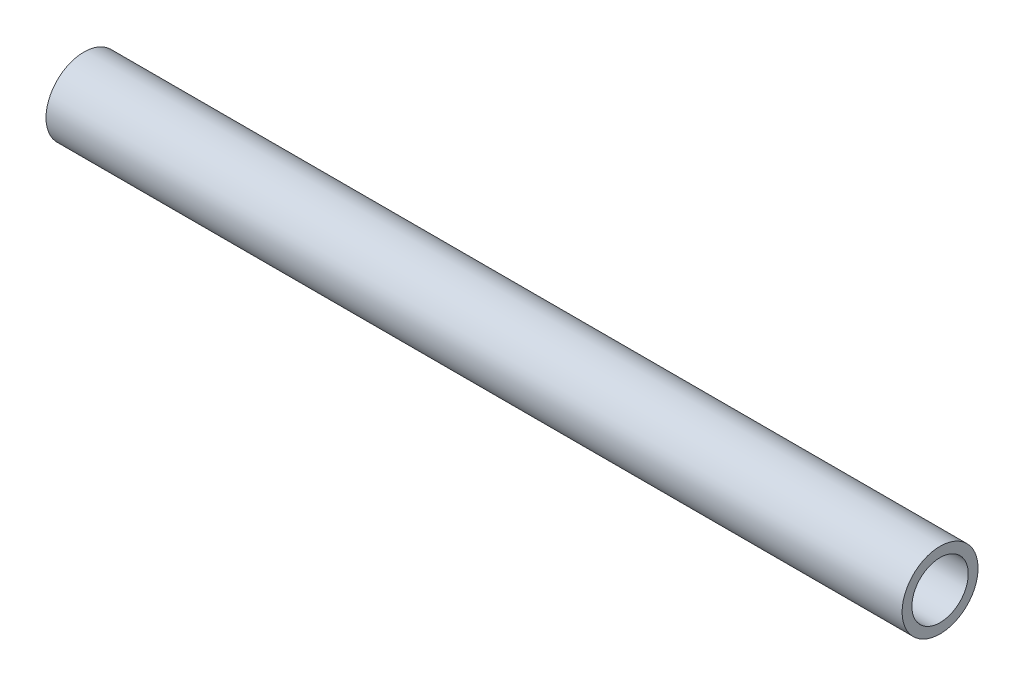
ISO-10303-21;
HEADER;
FILE_DESCRIPTION(('STEP AP214'),'2;1');
FILE_NAME('part.step','',(''),(''),'','','');
FILE_SCHEMA(('AUTOMOTIVE_DESIGN { 1 0 10303 214 1 1 1 1 }'));
ENDSEC;
DATA;
#1=APPLICATION_CONTEXT('core data for automotive mechanical design processes');
#2=APPLICATION_PROTOCOL_DEFINITION('international standard','automotive_design',2000,#1);
#3=PRODUCT_CONTEXT('',#1,'mechanical');
#4=PRODUCT('Part','Part','',(#3));
#5=PRODUCT_RELATED_PRODUCT_CATEGORY('part','',(#4));
#6=PRODUCT_DEFINITION_FORMATION('','',#4);
#7=PRODUCT_DEFINITION_CONTEXT('part definition',#1,'design');
#8=PRODUCT_DEFINITION('design','',#6,#7);
#9=PRODUCT_DEFINITION_SHAPE('','',#8);
#10=(LENGTH_UNIT() NAMED_UNIT(*) SI_UNIT(.MILLI.,.METRE.));
#11=(NAMED_UNIT(*) PLANE_ANGLE_UNIT() SI_UNIT($,.RADIAN.));
#12=(NAMED_UNIT(*) SI_UNIT($,.STERADIAN.) SOLID_ANGLE_UNIT());
#13=UNCERTAINTY_MEASURE_WITH_UNIT(LENGTH_MEASURE(1.E-05),#10,'distance_accuracy_value','');
#14=(GEOMETRIC_REPRESENTATION_CONTEXT(3) GLOBAL_UNCERTAINTY_ASSIGNED_CONTEXT((#13)) GLOBAL_UNIT_ASSIGNED_CONTEXT((#10,
#11,#12)) REPRESENTATION_CONTEXT('',''));
#15=CARTESIAN_POINT('',(0.,0.,0.));
#16=DIRECTION('',(0.,0.,1.));
#17=DIRECTION('',(1.,0.,0.));
#18=AXIS2_PLACEMENT_3D('',#15,#16,#17);
#19=CARTESIAN_POINT('',(240.,1.11022302462516E-13,0.));
#20=DIRECTION('',(0.999999999999997,0.,0.));
#21=DIRECTION('',(0.,0.,-1.));
#22=AXIS2_PLACEMENT_3D('',#19,#20,#21);
#23=PLANE('',#22);
#24=CARTESIAN_POINT('',(240.,1.11022302462516E-13,0.));
#25=DIRECTION('',(0.999999999999997,0.,0.));
#26=DIRECTION('',(0.,0.,-1.));
#27=AXIS2_PLACEMENT_3D('',#24,#25,#26);
#28=CIRCLE('',#27,10.65);
#29=CARTESIAN_POINT('',(240.,1.06883946138225E-13,10.65));
#30=VERTEX_POINT('',#29);
#31=EDGE_CURVE('E10',#30,#30,#28,.T.);
#32=ORIENTED_EDGE('',*,*,#31,.T.);
#33=EDGE_LOOP('',(#32));
#34=FACE_BOUND('',#33,.T.);
#35=CARTESIAN_POINT('',(240.,1.11022302462516E-13,0.));
#36=DIRECTION('',(0.999999999999997,0.,0.));
#37=DIRECTION('',(0.,0.,-1.));
#38=AXIS2_PLACEMENT_3D('',#35,#36,#37);
#39=CIRCLE('',#38,7.9);
#40=CARTESIAN_POINT('',(240.,1.07952535799427E-13,7.9));
#41=VERTEX_POINT('',#40);
#42=EDGE_CURVE('E39',#41,#41,#39,.T.);
#43=ORIENTED_EDGE('',*,*,#42,.F.);
#44=EDGE_LOOP('',(#43));
#45=FACE_BOUND('',#44,.T.);
#46=ADVANCED_FACE('F28',(#34,#45),#23,.T.);
#47=CARTESIAN_POINT('',(0.,0.,0.));
#48=DIRECTION('',(0.999999999999997,0.,0.));
#49=DIRECTION('',(0.,0.,-1.));
#50=AXIS2_PLACEMENT_3D('',#47,#48,#49);
#51=PLANE('',#50);
#52=CARTESIAN_POINT('',(0.,0.,0.));
#53=DIRECTION('',(0.999999999999997,0.,0.));
#54=DIRECTION('',(0.,0.,-1.));
#55=AXIS2_PLACEMENT_3D('',#52,#53,#54);
#56=CIRCLE('',#55,10.65);
#57=CARTESIAN_POINT('',(0.,0.,10.65));
#58=VERTEX_POINT('',#57);
#59=EDGE_CURVE('E32',#58,#58,#56,.T.);
#60=ORIENTED_EDGE('',*,*,#59,.F.);
#61=EDGE_LOOP('',(#60));
#62=FACE_BOUND('',#61,.T.);
#63=CARTESIAN_POINT('',(0.,0.,0.));
#64=DIRECTION('',(0.999999999999997,0.,0.));
#65=DIRECTION('',(0.,0.,-1.));
#66=AXIS2_PLACEMENT_3D('',#63,#64,#65);
#67=CIRCLE('',#66,7.9);
#68=CARTESIAN_POINT('',(0.,0.,7.89999999999999));
#69=VERTEX_POINT('',#68);
#70=EDGE_CURVE('E41',#69,#69,#67,.T.);
#71=ORIENTED_EDGE('',*,*,#70,.T.);
#72=EDGE_LOOP('',(#71));
#73=FACE_BOUND('',#72,.T.);
#74=ADVANCED_FACE('F51',(#62,#73),#51,.F.);
#75=CARTESIAN_POINT('',(240.,1.11022302462516E-13,0.));
#76=DIRECTION('',(-0.999999999999997,0.,0.));
#77=DIRECTION('',(0.,0.,1.));
#78=AXIS2_PLACEMENT_3D('',#75,#76,#77);
#79=CYLINDRICAL_SURFACE('',#78,10.65);
#80=CARTESIAN_POINT('',(240.,1.06883946138225E-13,10.65));
#81=CARTESIAN_POINT('',(237.5,1.06385266476022E-13,10.65));
#82=CARTESIAN_POINT('',(235.,1.05886586813819E-13,10.65));
#83=CARTESIAN_POINT('',(230.,1.04889227489413E-13,10.65));
#84=CARTESIAN_POINT('',(227.5,1.0439054782721E-13,10.65));
#85=CARTESIAN_POINT('',(222.5,1.03393188502804E-13,10.65));
#86=CARTESIAN_POINT('',(220.,1.02894508840601E-13,10.65));
#87=CARTESIAN_POINT('',(215.,1.01897149516196E-13,10.65));
#88=CARTESIAN_POINT('',(212.5,1.01398469853993E-13,10.65));
#89=CARTESIAN_POINT('',(207.5,1.00401110529587E-13,10.65));
#90=CARTESIAN_POINT('',(205.,0.,10.65));
#91=CARTESIAN_POINT('',(200.,0.,10.65));
#92=CARTESIAN_POINT('',(197.5,0.,10.65));
#93=CARTESIAN_POINT('',(192.5,0.,10.65));
#94=CARTESIAN_POINT('',(190.,0.,10.65));
#95=CARTESIAN_POINT('',(185.,0.,10.65));
#96=CARTESIAN_POINT('',(182.5,0.,10.65));
#97=CARTESIAN_POINT('',(177.5,0.,10.65));
#98=CARTESIAN_POINT('',(175.,0.,10.65));
#99=CARTESIAN_POINT('',(170.,0.,10.65));
#100=CARTESIAN_POINT('',(167.5,0.,10.65));
#101=CARTESIAN_POINT('',(162.5,0.,10.65));
#102=CARTESIAN_POINT('',(160.,0.,10.65));
#103=CARTESIAN_POINT('',(155.,0.,10.65));
#104=CARTESIAN_POINT('',(152.5,0.,10.65));
#105=CARTESIAN_POINT('',(147.5,0.,10.65));
#106=CARTESIAN_POINT('',(145.,0.,10.65));
#107=CARTESIAN_POINT('',(140.,0.,10.65));
#108=CARTESIAN_POINT('',(137.5,0.,10.65));
#109=CARTESIAN_POINT('',(132.5,0.,10.65));
#110=CARTESIAN_POINT('',(130.,0.,10.65));
#111=CARTESIAN_POINT('',(125.,0.,10.65));
#112=CARTESIAN_POINT('',(122.5,0.,10.65));
#113=CARTESIAN_POINT('',(117.5,0.,10.65));
#114=CARTESIAN_POINT('',(115.,0.,10.65));
#115=CARTESIAN_POINT('',(110.,0.,10.65));
#116=CARTESIAN_POINT('',(107.5,0.,10.65));
#117=CARTESIAN_POINT('',(102.5,0.,10.65));
#118=CARTESIAN_POINT('',(99.9999999999999,0.,10.65));
#119=CARTESIAN_POINT('',(94.9999999999999,0.,10.65));
#120=CARTESIAN_POINT('',(92.4999999999999,0.,10.65));
#121=CARTESIAN_POINT('',(87.4999999999999,0.,10.65));
#122=CARTESIAN_POINT('',(84.9999999999999,0.,10.65));
#123=CARTESIAN_POINT('',(79.9999999999999,0.,10.65));
#124=CARTESIAN_POINT('',(77.4999999999999,0.,10.65));
#125=CARTESIAN_POINT('',(72.4999999999999,0.,10.65));
#126=CARTESIAN_POINT('',(69.9999999999999,0.,10.65));
#127=CARTESIAN_POINT('',(64.9999999999999,0.,10.65));
#128=CARTESIAN_POINT('',(62.4999999999999,0.,10.65));
#129=CARTESIAN_POINT('',(57.4999999999999,0.,10.65));
#130=CARTESIAN_POINT('',(54.9999999999999,0.,10.65));
#131=CARTESIAN_POINT('',(49.9999999999999,0.,10.65));
#132=CARTESIAN_POINT('',(47.4999999999999,0.,10.65));
#133=CARTESIAN_POINT('',(42.4999999999999,0.,10.65));
#134=CARTESIAN_POINT('',(39.9999999999999,0.,10.65));
#135=CARTESIAN_POINT('',(35.,0.,10.65));
#136=CARTESIAN_POINT('',(32.5,0.,10.65));
#137=CARTESIAN_POINT('',(27.5,0.,10.65));
#138=CARTESIAN_POINT('',(24.9999999999999,0.,10.65));
#139=CARTESIAN_POINT('',(19.9999999999999,0.,10.65));
#140=CARTESIAN_POINT('',(17.5,0.,10.65));
#141=CARTESIAN_POINT('',(12.5,0.,10.65));
#142=CARTESIAN_POINT('',(9.99999999999995,0.,10.65));
#143=CARTESIAN_POINT('',(4.99999999999996,0.,10.65));
#144=CARTESIAN_POINT('',(2.49999999999997,0.,10.65));
#145=CARTESIAN_POINT('',(0.,0.,10.65));
#146=B_SPLINE_CURVE_WITH_KNOTS('',3,(#80,#81,#82,#83,#84,#85,#86,#87,#88,#89,#90,#91,#92,#93,
#94,#95,#96,#97,#98,#99,#100,#101,#102,#103,#104,#105,#106,#107,#108,#109,#110,#111,#112,#113,
#114,#115,#116,#117,#118,#119,#120,#121,#122,#123,#124,#125,#126,#127,#128,#129,#130,#131,#132,
#133,#134,#135,#136,#137,#138,#139,#140,#141,#142,#143,#144,#145),.UNSPECIFIED.,.F.,.F.,(4,2,2,
2,2,2,2,2,2,2,2,2,2,2,2,2,2,2,2,2,2,2,2,2,2,2,2,2,2,2,2,2,4),(0.,7.50000000000001,15.,22.5,30.,
37.5,45.,52.5,60.,67.4999999999999,75.,82.5,89.9999999999999,97.4999999999999,105.,112.5,120.,
127.5,135.,142.5,150.,157.5,165.,172.5,180.,187.5,195.,202.5,210.,217.5,225.,232.5,240.),.UNSPECIFIED.);
#147=EDGE_CURVE('BSEAM30',#30,#58,#146,.T.);
#148=ORIENTED_EDGE('',*,*,#31,.F.);
#149=ORIENTED_EDGE('',*,*,#59,.T.);
#150=ORIENTED_EDGE('',*,*,#147,.T.);
#151=ORIENTED_EDGE('',*,*,#147,.F.);
#152=EDGE_LOOP('',(#148,#150,#149,#151));
#153=FACE_BOUND('',#152,.T.);
#154=ADVANCED_FACE('F30',(#153),#79,.T.);
#155=CARTESIAN_POINT('',(240.,1.11022302462516E-13,0.));
#156=DIRECTION('',(-0.999999999999997,0.,0.));
#157=DIRECTION('',(0.,0.,1.));
#158=AXIS2_PLACEMENT_3D('',#155,#156,#157);
#159=CYLINDRICAL_SURFACE('',#158,7.9);
#160=CARTESIAN_POINT('',(240.,1.07952535799427E-13,7.9));
#161=CARTESIAN_POINT('',(237.5,1.07453856137224E-13,7.9));
#162=CARTESIAN_POINT('',(235.,1.06955176475021E-13,7.9));
#163=CARTESIAN_POINT('',(230.,1.05957817150615E-13,7.9));
#164=CARTESIAN_POINT('',(227.5,1.05459137488412E-13,7.9));
#165=CARTESIAN_POINT('',(222.5,1.04461778164006E-13,7.9));
#166=CARTESIAN_POINT('',(220.,1.03963098501803E-13,7.9));
#167=CARTESIAN_POINT('',(215.,1.02965739177397E-13,7.9));
#168=CARTESIAN_POINT('',(212.5,1.02467059515194E-13,7.9));
#169=CARTESIAN_POINT('',(207.5,1.01469700190788E-13,7.9));
#170=CARTESIAN_POINT('',(205.,1.00971020528585E-13,7.9));
#171=CARTESIAN_POINT('',(200.,0.,7.9));
#172=CARTESIAN_POINT('',(197.5,0.,7.9));
#173=CARTESIAN_POINT('',(192.5,0.,7.9));
#174=CARTESIAN_POINT('',(190.,0.,7.9));
#175=CARTESIAN_POINT('',(185.,0.,7.9));
#176=CARTESIAN_POINT('',(182.5,0.,7.9));
#177=CARTESIAN_POINT('',(177.5,0.,7.9));
#178=CARTESIAN_POINT('',(175.,0.,7.9));
#179=CARTESIAN_POINT('',(170.,0.,7.9));
#180=CARTESIAN_POINT('',(167.5,0.,7.9));
#181=CARTESIAN_POINT('',(162.5,0.,7.9));
#182=CARTESIAN_POINT('',(160.,0.,7.9));
#183=CARTESIAN_POINT('',(155.,0.,7.9));
#184=CARTESIAN_POINT('',(152.5,0.,7.9));
#185=CARTESIAN_POINT('',(147.5,0.,7.9));
#186=CARTESIAN_POINT('',(145.,0.,7.9));
#187=CARTESIAN_POINT('',(140.,0.,7.9));
#188=CARTESIAN_POINT('',(137.5,0.,7.9));
#189=CARTESIAN_POINT('',(132.5,0.,7.9));
#190=CARTESIAN_POINT('',(130.,0.,7.9));
#191=CARTESIAN_POINT('',(125.,0.,7.9));
#192=CARTESIAN_POINT('',(122.5,0.,7.9));
#193=CARTESIAN_POINT('',(117.5,0.,7.9));
#194=CARTESIAN_POINT('',(115.,0.,7.9));
#195=CARTESIAN_POINT('',(110.,0.,7.9));
#196=CARTESIAN_POINT('',(107.5,0.,7.9));
#197=CARTESIAN_POINT('',(102.5,0.,7.9));
#198=CARTESIAN_POINT('',(99.9999999999999,0.,7.9));
#199=CARTESIAN_POINT('',(94.9999999999999,0.,7.9));
#200=CARTESIAN_POINT('',(92.4999999999999,0.,7.9));
#201=CARTESIAN_POINT('',(87.4999999999999,0.,7.9));
#202=CARTESIAN_POINT('',(84.9999999999999,0.,7.9));
#203=CARTESIAN_POINT('',(79.9999999999999,0.,7.9));
#204=CARTESIAN_POINT('',(77.4999999999999,0.,7.9));
#205=CARTESIAN_POINT('',(72.4999999999999,0.,7.9));
#206=CARTESIAN_POINT('',(69.9999999999999,0.,7.9));
#207=CARTESIAN_POINT('',(64.9999999999999,0.,7.9));
#208=CARTESIAN_POINT('',(62.4999999999999,0.,7.9));
#209=CARTESIAN_POINT('',(57.4999999999999,0.,7.9));
#210=CARTESIAN_POINT('',(54.9999999999999,0.,7.9));
#211=CARTESIAN_POINT('',(49.9999999999999,0.,7.9));
#212=CARTESIAN_POINT('',(47.4999999999999,0.,7.9));
#213=CARTESIAN_POINT('',(42.4999999999999,0.,7.9));
#214=CARTESIAN_POINT('',(39.9999999999999,0.,7.89999999999999));
#215=CARTESIAN_POINT('',(35.,0.,7.89999999999999));
#216=CARTESIAN_POINT('',(32.4999999999999,0.,7.89999999999999));
#217=CARTESIAN_POINT('',(27.4999999999999,0.,7.89999999999999));
#218=CARTESIAN_POINT('',(24.9999999999999,0.,7.89999999999999));
#219=CARTESIAN_POINT('',(19.9999999999999,0.,7.89999999999999));
#220=CARTESIAN_POINT('',(17.5,0.,7.89999999999999));
#221=CARTESIAN_POINT('',(12.5,0.,7.89999999999999));
#222=CARTESIAN_POINT('',(9.99999999999995,0.,7.89999999999999));
#223=CARTESIAN_POINT('',(4.99999999999996,0.,7.89999999999999));
#224=CARTESIAN_POINT('',(2.49999999999997,0.,7.89999999999999));
#225=CARTESIAN_POINT('',(0.,0.,7.89999999999999));
#226=B_SPLINE_CURVE_WITH_KNOTS('',3,(#160,#161,#162,#163,#164,#165,#166,#167,#168,#169,#170,
#171,#172,#173,#174,#175,#176,#177,#178,#179,#180,#181,#182,#183,#184,#185,#186,#187,#188,#189,
#190,#191,#192,#193,#194,#195,#196,#197,#198,#199,#200,#201,#202,#203,#204,#205,#206,#207,#208,
#209,#210,#211,#212,#213,#214,#215,#216,#217,#218,#219,#220,#221,#222,#223,#224,#225),
.UNSPECIFIED.,.F.,.F.,(4,2,2,2,2,2,2,2,2,2,2,2,2,2,2,2,2,2,2,2,2,2,2,2,2,2,2,2,2,2,2,2,4),(0.,
7.49999999999998,15.,22.5,29.9999999999999,37.5,45.,52.4999999999999,59.9999999999999,
67.4999999999999,74.9999999999999,82.4999999999999,89.9999999999999,97.4999999999999,105.,112.5,
120.,127.5,135.,142.5,150.,157.5,165.,172.5,180.,187.5,195.,202.5,210.,217.5,225.,232.5,240.),.UNSPECIFIED.);
#227=EDGE_CURVE('BSEAM47',#41,#69,#226,.T.);
#228=ORIENTED_EDGE('',*,*,#42,.T.);
#229=ORIENTED_EDGE('',*,*,#70,.F.);
#230=ORIENTED_EDGE('',*,*,#227,.T.);
#231=ORIENTED_EDGE('',*,*,#227,.F.);
#232=EDGE_LOOP('',(#228,#230,#229,#231));
#233=FACE_BOUND('',#232,.T.);
#234=ADVANCED_FACE('F47',(#233),#159,.F.);
#235=CLOSED_SHELL('',(#46,#74,#154,#234));
#236=MANIFOLD_SOLID_BREP('B2',#235);
#237=ADVANCED_BREP_SHAPE_REPRESENTATION('',(#18,#236),#14);
#238=SHAPE_DEFINITION_REPRESENTATION(#9,#237);
ENDSEC;
END-ISO-10303-21;
